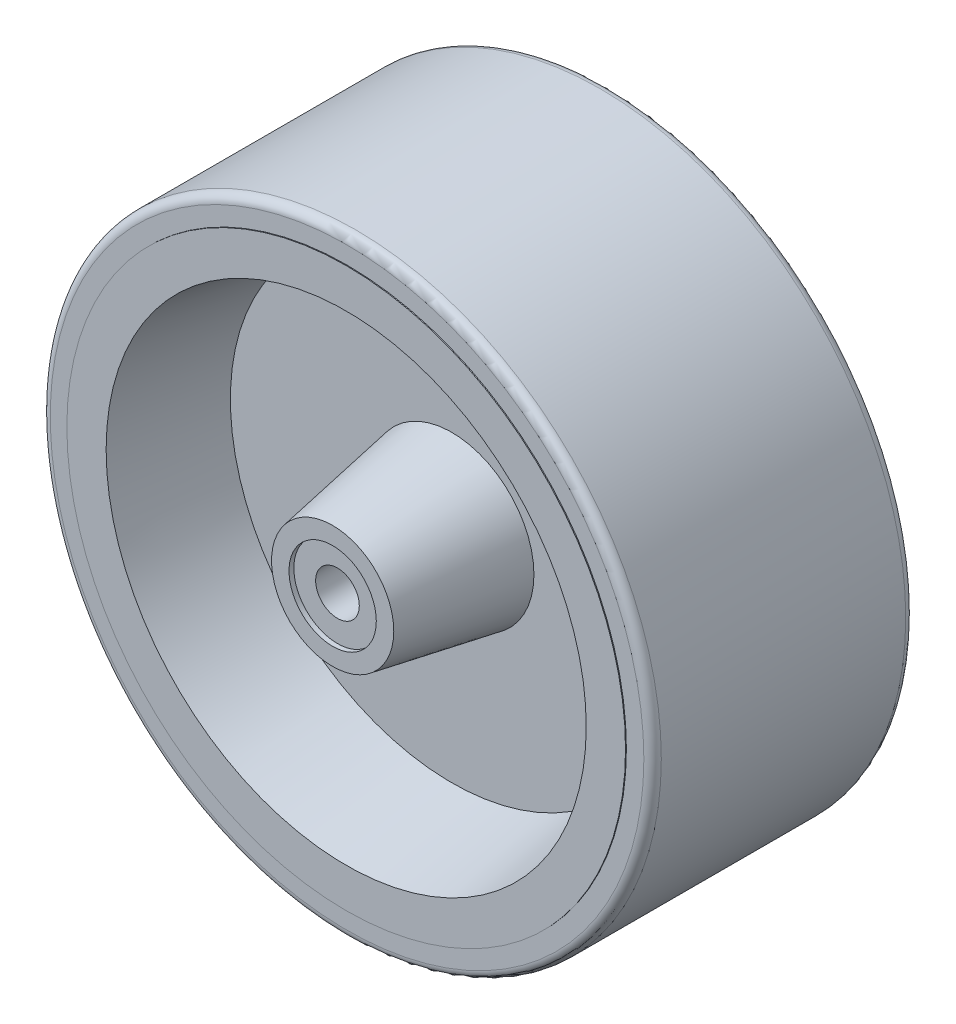
ISO-10303-21;
HEADER;
FILE_DESCRIPTION(('STEP AP214'),'2;1');
FILE_NAME('part.step','',(''),(''),'','','');
FILE_SCHEMA(('AUTOMOTIVE_DESIGN { 1 0 10303 214 1 1 1 1 }'));
ENDSEC;
DATA;
#1=APPLICATION_CONTEXT('core data for automotive mechanical design processes');
#2=APPLICATION_PROTOCOL_DEFINITION('international standard','automotive_design',2000,#1);
#3=PRODUCT_CONTEXT('',#1,'mechanical');
#4=PRODUCT('Part','Part','',(#3));
#5=PRODUCT_RELATED_PRODUCT_CATEGORY('part','',(#4));
#6=PRODUCT_DEFINITION_FORMATION('','',#4);
#7=PRODUCT_DEFINITION_CONTEXT('part definition',#1,'design');
#8=PRODUCT_DEFINITION('design','',#6,#7);
#9=PRODUCT_DEFINITION_SHAPE('','',#8);
#10=(LENGTH_UNIT() NAMED_UNIT(*) SI_UNIT(.MILLI.,.METRE.));
#11=(NAMED_UNIT(*) PLANE_ANGLE_UNIT() SI_UNIT($,.RADIAN.));
#12=(NAMED_UNIT(*) SI_UNIT($,.STERADIAN.) SOLID_ANGLE_UNIT());
#13=UNCERTAINTY_MEASURE_WITH_UNIT(LENGTH_MEASURE(1.E-05),#10,'distance_accuracy_value','');
#14=(GEOMETRIC_REPRESENTATION_CONTEXT(3) GLOBAL_UNCERTAINTY_ASSIGNED_CONTEXT((#13)) GLOBAL_UNIT_ASSIGNED_CONTEXT((#10,
#11,#12)) REPRESENTATION_CONTEXT('',''));
#15=CARTESIAN_POINT('',(0.,0.,0.));
#16=DIRECTION('',(0.,0.,1.));
#17=DIRECTION('',(1.,0.,0.));
#18=AXIS2_PLACEMENT_3D('',#15,#16,#17);
#19=CARTESIAN_POINT('',(0.,0.,-40.894));
#20=DIRECTION('',(0.,0.,1.));
#21=DIRECTION('',(1.,0.,0.));
#22=AXIS2_PLACEMENT_3D('',#19,#20,#21);
#23=PLANE('',#22);
#24=CARTESIAN_POINT('',(0.,0.,-40.894));
#25=DIRECTION('',(0.,0.,1.));
#26=DIRECTION('',(1.,0.,0.));
#27=AXIS2_PLACEMENT_3D('',#24,#25,#26);
#28=CIRCLE('',#27,6.35);
#29=CARTESIAN_POINT('',(6.35,0.,-40.894));
#30=VERTEX_POINT('',#29);
#31=EDGE_CURVE('E49',#30,#30,#28,.T.);
#32=ORIENTED_EDGE('',*,*,#31,.T.);
#33=EDGE_LOOP('',(#32));
#34=FACE_BOUND('',#33,.T.);
#35=CARTESIAN_POINT('',(0.,0.,-40.894));
#36=DIRECTION('',(0.,0.,1.));
#37=DIRECTION('',(1.,0.,0.));
#38=AXIS2_PLACEMENT_3D('',#35,#36,#37);
#39=CIRCLE('',#38,12.7);
#40=CARTESIAN_POINT('',(12.7,0.,-40.894));
#41=VERTEX_POINT('',#40);
#42=EDGE_CURVE('E105',#41,#41,#39,.T.);
#43=ORIENTED_EDGE('',*,*,#42,.F.);
#44=EDGE_LOOP('',(#43));
#45=FACE_BOUND('',#44,.T.);
#46=ADVANCED_FACE('F46',(#34,#45),#23,.F.);
#47=CARTESIAN_POINT('',(0.,0.,40.894));
#48=DIRECTION('',(0.,0.,-1.));
#49=DIRECTION('',(-1.,0.,0.));
#50=AXIS2_PLACEMENT_3D('',#47,#48,#49);
#51=PLANE('',#50);
#52=CARTESIAN_POINT('',(0.,0.,40.894));
#53=DIRECTION('',(0.,0.,1.));
#54=DIRECTION('',(1.,0.,0.));
#55=AXIS2_PLACEMENT_3D('',#52,#53,#54);
#56=CIRCLE('',#55,6.35);
#57=CARTESIAN_POINT('',(6.35,0.,40.894));
#58=VERTEX_POINT('',#57);
#59=EDGE_CURVE('E109',#58,#58,#56,.T.);
#60=ORIENTED_EDGE('',*,*,#59,.F.);
#61=EDGE_LOOP('',(#60));
#62=FACE_BOUND('',#61,.T.);
#63=CARTESIAN_POINT('',(0.,0.,40.894));
#64=DIRECTION('',(0.,0.,1.));
#65=DIRECTION('',(1.,0.,0.));
#66=AXIS2_PLACEMENT_3D('',#63,#64,#65);
#67=CIRCLE('',#66,12.7);
#68=CARTESIAN_POINT('',(12.7,0.,40.894));
#69=VERTEX_POINT('',#68);
#70=EDGE_CURVE('E11',#69,#69,#67,.T.);
#71=ORIENTED_EDGE('',*,*,#70,.T.);
#72=EDGE_LOOP('',(#71));
#73=FACE_BOUND('',#72,.T.);
#74=ADVANCED_FACE('F131',(#62,#73),#51,.F.);
#75=CARTESIAN_POINT('',(0.,0.,0.));
#76=DIRECTION('',(0.,0.,1.));
#77=DIRECTION('',(1.,0.,0.));
#78=AXIS2_PLACEMENT_3D('',#75,#76,#77);
#79=CYLINDRICAL_SURFACE('',#78,12.7);
#80=ORIENTED_EDGE('',*,*,#70,.F.);
#81=EDGE_LOOP('',(#80));
#82=FACE_BOUND('',#81,.T.);
#83=CARTESIAN_POINT('',(0.,0.,42.291));
#84=DIRECTION('',(0.,0.,1.));
#85=DIRECTION('',(1.,0.,0.));
#86=AXIS2_PLACEMENT_3D('',#83,#84,#85);
#87=CIRCLE('',#86,12.7);
#88=CARTESIAN_POINT('',(12.7,0.,42.291));
#89=VERTEX_POINT('',#88);
#90=EDGE_CURVE('E54',#89,#89,#87,.T.);
#91=ORIENTED_EDGE('',*,*,#90,.T.);
#92=EDGE_LOOP('',(#91));
#93=FACE_BOUND('',#92,.T.);
#94=ADVANCED_FACE('F135',(#82,#93),#79,.F.);
#95=CARTESIAN_POINT('',(-12.7,0.,42.291));
#96=DIRECTION('',(0.,0.,-1.));
#97=DIRECTION('',(-1.,0.,0.));
#98=AXIS2_PLACEMENT_3D('',#95,#96,#97);
#99=PLANE('',#98);
#100=ORIENTED_EDGE('',*,*,#90,.F.);
#101=EDGE_LOOP('',(#100));
#102=FACE_BOUND('',#101,.T.);
#103=CARTESIAN_POINT('',(0.,0.,42.291));
#104=DIRECTION('',(0.,0.,1.));
#105=DIRECTION('',(1.,0.,0.));
#106=AXIS2_PLACEMENT_3D('',#103,#104,#105);
#107=CIRCLE('',#106,17.78);
#108=CARTESIAN_POINT('',(17.78,0.,42.291));
#109=VERTEX_POINT('',#108);
#110=EDGE_CURVE('E59',#109,#109,#107,.T.);
#111=ORIENTED_EDGE('',*,*,#110,.T.);
#112=EDGE_LOOP('',(#111));
#113=FACE_BOUND('',#112,.T.);
#114=ADVANCED_FACE('F140',(#102,#113),#99,.F.);
#115=CARTESIAN_POINT('',(0.,0.,7.62));
#116=DIRECTION('',(0.,0.,-1.));
#117=DIRECTION('',(-1.,0.,0.));
#118=AXIS2_PLACEMENT_3D('',#115,#116,#117);
#119=CONICAL_SURFACE('',#118,23.8934327481431,0.17453292519943);
#120=ORIENTED_EDGE('',*,*,#110,.F.);
#121=EDGE_LOOP('',(#120));
#122=FACE_BOUND('',#121,.T.);
#123=CARTESIAN_POINT('',(0.,0.,7.62));
#124=DIRECTION('',(0.,0.,1.));
#125=DIRECTION('',(1.,0.,0.));
#126=AXIS2_PLACEMENT_3D('',#123,#124,#125);
#127=CIRCLE('',#126,23.8934327481431);
#128=CARTESIAN_POINT('',(23.8934327481431,0.,7.62));
#129=VERTEX_POINT('',#128);
#130=EDGE_CURVE('E65',#129,#129,#127,.T.);
#131=ORIENTED_EDGE('',*,*,#130,.T.);
#132=EDGE_LOOP('',(#131));
#133=FACE_BOUND('',#132,.T.);
#134=ADVANCED_FACE('F146',(#122,#133),#119,.T.);
#135=CARTESIAN_POINT('',(-23.8934327481431,0.,7.62));
#136=DIRECTION('',(0.,0.,-1.));
#137=DIRECTION('',(-1.,0.,0.));
#138=AXIS2_PLACEMENT_3D('',#135,#136,#137);
#139=PLANE('',#138);
#140=ORIENTED_EDGE('',*,*,#130,.F.);
#141=EDGE_LOOP('',(#140));
#142=FACE_BOUND('',#141,.T.);
#143=CARTESIAN_POINT('',(0.,0.,7.62000000000001));
#144=DIRECTION('',(0.,0.,1.));
#145=DIRECTION('',(1.,0.,0.));
#146=AXIS2_PLACEMENT_3D('',#143,#144,#145);
#147=CIRCLE('',#146,64.4307665749062);
#148=CARTESIAN_POINT('',(64.4307665749062,0.,7.62000000000001));
#149=VERTEX_POINT('',#148);
#150=EDGE_CURVE('E69',#149,#149,#147,.T.);
#151=ORIENTED_EDGE('',*,*,#150,.T.);
#152=EDGE_LOOP('',(#151));
#153=FACE_BOUND('',#152,.T.);
#154=ADVANCED_FACE('F150',(#142,#153),#139,.F.);
#155=CARTESIAN_POINT('',(0.,0.,38.354));
#156=DIRECTION('',(0.,0.,1.));
#157=DIRECTION('',(1.,0.,0.));
#158=AXIS2_PLACEMENT_3D('',#155,#156,#157);
#159=CONICAL_SURFACE('',#158,69.85,0.174532925199429);
#160=ORIENTED_EDGE('',*,*,#150,.F.);
#161=EDGE_LOOP('',(#160));
#162=FACE_BOUND('',#161,.T.);
#163=CARTESIAN_POINT('',(0.,0.,38.354));
#164=DIRECTION('',(0.,0.,1.));
#165=DIRECTION('',(1.,0.,0.));
#166=AXIS2_PLACEMENT_3D('',#163,#164,#165);
#167=CIRCLE('',#166,69.85);
#168=CARTESIAN_POINT('',(69.85,0.,38.354));
#169=VERTEX_POINT('',#168);
#170=EDGE_CURVE('E73',#169,#169,#167,.T.);
#171=ORIENTED_EDGE('',*,*,#170,.T.);
#172=EDGE_LOOP('',(#171));
#173=FACE_BOUND('',#172,.T.);
#174=ADVANCED_FACE('F154',(#162,#173),#159,.F.);
#175=CARTESIAN_POINT('',(-69.85,0.,38.354));
#176=DIRECTION('',(0.,0.,-1.));
#177=DIRECTION('',(-1.,0.,0.));
#178=AXIS2_PLACEMENT_3D('',#175,#176,#177);
#179=PLANE('',#178);
#180=ORIENTED_EDGE('',*,*,#170,.F.);
#181=EDGE_LOOP('',(#180));
#182=FACE_BOUND('',#181,.T.);
#183=CARTESIAN_POINT('',(0.,0.,38.354));
#184=DIRECTION('',(0.,0.,1.));
#185=DIRECTION('',(1.,0.,0.));
#186=AXIS2_PLACEMENT_3D('',#183,#184,#185);
#187=CIRCLE('',#186,81.28);
#188=CARTESIAN_POINT('',(81.28,0.,38.354));
#189=VERTEX_POINT('',#188);
#190=EDGE_CURVE('E77',#189,#189,#187,.T.);
#191=ORIENTED_EDGE('',*,*,#190,.T.);
#192=EDGE_LOOP('',(#191));
#193=FACE_BOUND('',#192,.T.);
#194=ADVANCED_FACE('F158',(#182,#193),#179,.F.);
#195=CARTESIAN_POINT('',(0.,0.,0.));
#196=DIRECTION('',(0.,0.,1.));
#197=DIRECTION('',(1.,0.,0.));
#198=AXIS2_PLACEMENT_3D('',#195,#196,#197);
#199=CYLINDRICAL_SURFACE('',#198,81.28);
#200=ORIENTED_EDGE('',*,*,#190,.F.);
#201=EDGE_LOOP('',(#200));
#202=FACE_BOUND('',#201,.T.);
#203=CARTESIAN_POINT('',(0.,0.,-38.354));
#204=DIRECTION('',(0.,0.,1.));
#205=DIRECTION('',(1.,0.,0.));
#206=AXIS2_PLACEMENT_3D('',#203,#204,#205);
#207=CIRCLE('',#206,81.28);
#208=CARTESIAN_POINT('',(81.28,0.,-38.354));
#209=VERTEX_POINT('',#208);
#210=EDGE_CURVE('E81',#209,#209,#207,.T.);
#211=ORIENTED_EDGE('',*,*,#210,.T.);
#212=EDGE_LOOP('',(#211));
#213=FACE_BOUND('',#212,.T.);
#214=ADVANCED_FACE('F162',(#202,#213),#199,.T.);
#215=CARTESIAN_POINT('',(-69.85,0.,-38.354));
#216=DIRECTION('',(0.,0.,1.));
#217=DIRECTION('',(1.,0.,0.));
#218=AXIS2_PLACEMENT_3D('',#215,#216,#217);
#219=PLANE('',#218);
#220=ORIENTED_EDGE('',*,*,#210,.F.);
#221=EDGE_LOOP('',(#220));
#222=FACE_BOUND('',#221,.T.);
#223=CARTESIAN_POINT('',(0.,0.,-38.354));
#224=DIRECTION('',(0.,0.,1.));
#225=DIRECTION('',(1.,0.,0.));
#226=AXIS2_PLACEMENT_3D('',#223,#224,#225);
#227=CIRCLE('',#226,69.85);
#228=CARTESIAN_POINT('',(69.85,0.,-38.354));
#229=VERTEX_POINT('',#228);
#230=EDGE_CURVE('E85',#229,#229,#227,.T.);
#231=ORIENTED_EDGE('',*,*,#230,.T.);
#232=EDGE_LOOP('',(#231));
#233=FACE_BOUND('',#232,.T.);
#234=ADVANCED_FACE('F166',(#222,#233),#219,.F.);
#235=CARTESIAN_POINT('',(0.,0.,-7.62000000000001));
#236=DIRECTION('',(0.,0.,-1.));
#237=DIRECTION('',(-1.,0.,0.));
#238=AXIS2_PLACEMENT_3D('',#235,#236,#237);
#239=CONICAL_SURFACE('',#238,64.4307665749062,0.174532925199429);
#240=ORIENTED_EDGE('',*,*,#230,.F.);
#241=EDGE_LOOP('',(#240));
#242=FACE_BOUND('',#241,.T.);
#243=CARTESIAN_POINT('',(0.,0.,-7.62000000000001));
#244=DIRECTION('',(0.,0.,1.));
#245=DIRECTION('',(1.,0.,0.));
#246=AXIS2_PLACEMENT_3D('',#243,#244,#245);
#247=CIRCLE('',#246,64.4307665749062);
#248=CARTESIAN_POINT('',(64.4307665749062,0.,-7.62000000000001));
#249=VERTEX_POINT('',#248);
#250=EDGE_CURVE('E89',#249,#249,#247,.T.);
#251=ORIENTED_EDGE('',*,*,#250,.T.);
#252=EDGE_LOOP('',(#251));
#253=FACE_BOUND('',#252,.T.);
#254=ADVANCED_FACE('F170',(#242,#253),#239,.F.);
#255=CARTESIAN_POINT('',(-23.8934327481431,0.,-7.62));
#256=DIRECTION('',(0.,0.,1.));
#257=DIRECTION('',(1.,0.,0.));
#258=AXIS2_PLACEMENT_3D('',#255,#256,#257);
#259=PLANE('',#258);
#260=ORIENTED_EDGE('',*,*,#250,.F.);
#261=EDGE_LOOP('',(#260));
#262=FACE_BOUND('',#261,.T.);
#263=CARTESIAN_POINT('',(0.,0.,-7.62));
#264=DIRECTION('',(0.,0.,1.));
#265=DIRECTION('',(1.,0.,0.));
#266=AXIS2_PLACEMENT_3D('',#263,#264,#265);
#267=CIRCLE('',#266,23.8934327481431);
#268=CARTESIAN_POINT('',(23.8934327481431,0.,-7.62));
#269=VERTEX_POINT('',#268);
#270=EDGE_CURVE('E93',#269,#269,#267,.T.);
#271=ORIENTED_EDGE('',*,*,#270,.T.);
#272=EDGE_LOOP('',(#271));
#273=FACE_BOUND('',#272,.T.);
#274=ADVANCED_FACE('F174',(#262,#273),#259,.F.);
#275=CARTESIAN_POINT('',(0.,0.,-42.291));
#276=DIRECTION('',(0.,0.,1.));
#277=DIRECTION('',(1.,0.,0.));
#278=AXIS2_PLACEMENT_3D('',#275,#276,#277);
#279=CONICAL_SURFACE('',#278,17.78,0.17453292519943);
#280=ORIENTED_EDGE('',*,*,#270,.F.);
#281=EDGE_LOOP('',(#280));
#282=FACE_BOUND('',#281,.T.);
#283=CARTESIAN_POINT('',(0.,0.,-42.291));
#284=DIRECTION('',(0.,0.,1.));
#285=DIRECTION('',(1.,0.,0.));
#286=AXIS2_PLACEMENT_3D('',#283,#284,#285);
#287=CIRCLE('',#286,17.78);
#288=CARTESIAN_POINT('',(17.78,0.,-42.291));
#289=VERTEX_POINT('',#288);
#290=EDGE_CURVE('E97',#289,#289,#287,.T.);
#291=ORIENTED_EDGE('',*,*,#290,.T.);
#292=EDGE_LOOP('',(#291));
#293=FACE_BOUND('',#292,.T.);
#294=ADVANCED_FACE('F178',(#282,#293),#279,.T.);
#295=CARTESIAN_POINT('',(-12.7,0.,-42.291));
#296=DIRECTION('',(0.,0.,1.));
#297=DIRECTION('',(1.,0.,0.));
#298=AXIS2_PLACEMENT_3D('',#295,#296,#297);
#299=PLANE('',#298);
#300=ORIENTED_EDGE('',*,*,#290,.F.);
#301=EDGE_LOOP('',(#300));
#302=FACE_BOUND('',#301,.T.);
#303=CARTESIAN_POINT('',(0.,0.,-42.291));
#304=DIRECTION('',(0.,0.,1.));
#305=DIRECTION('',(1.,0.,0.));
#306=AXIS2_PLACEMENT_3D('',#303,#304,#305);
#307=CIRCLE('',#306,12.7);
#308=CARTESIAN_POINT('',(12.7,0.,-42.291));
#309=VERTEX_POINT('',#308);
#310=EDGE_CURVE('E101',#309,#309,#307,.T.);
#311=ORIENTED_EDGE('',*,*,#310,.T.);
#312=EDGE_LOOP('',(#311));
#313=FACE_BOUND('',#312,.T.);
#314=ADVANCED_FACE('F127',(#302,#313),#299,.F.);
#315=CARTESIAN_POINT('',(0.,0.,0.));
#316=DIRECTION('',(0.,0.,1.));
#317=DIRECTION('',(1.,0.,0.));
#318=AXIS2_PLACEMENT_3D('',#315,#316,#317);
#319=CYLINDRICAL_SURFACE('',#318,12.7);
#320=ORIENTED_EDGE('',*,*,#310,.F.);
#321=EDGE_LOOP('',(#320));
#322=FACE_BOUND('',#321,.T.);
#323=ORIENTED_EDGE('',*,*,#42,.T.);
#324=EDGE_LOOP('',(#323));
#325=FACE_BOUND('',#324,.T.);
#326=ADVANCED_FACE('F122',(#322,#325),#319,.F.);
#327=CARTESIAN_POINT('',(0.,0.,-42.291));
#328=DIRECTION('',(0.,0.,1.));
#329=DIRECTION('',(1.,0.,0.));
#330=AXIS2_PLACEMENT_3D('',#327,#328,#329);
#331=CYLINDRICAL_SURFACE('',#330,6.35);
#332=ORIENTED_EDGE('',*,*,#59,.T.);
#333=EDGE_LOOP('',(#332));
#334=FACE_BOUND('',#333,.T.);
#335=ORIENTED_EDGE('',*,*,#31,.F.);
#336=EDGE_LOOP('',(#335));
#337=FACE_BOUND('',#336,.T.);
#338=ADVANCED_FACE('F120',(#334,#337),#331,.F.);
#339=CLOSED_SHELL('',(#46,#74,#94,#114,#134,#154,#174,#194,#214,#234,#254,#274,#294,#314,#326,#338));
#340=MANIFOLD_SOLID_BREP('B2',#339);
#341=CARTESIAN_POINT('',(0.,0.,38.1));
#342=DIRECTION('',(0.,0.,1.));
#343=DIRECTION('',(1.,0.,0.));
#344=AXIS2_PLACEMENT_3D('',#341,#342,#343);
#345=PLANE('',#344);
#346=CARTESIAN_POINT('',(0.,0.,38.1));
#347=DIRECTION('',(0.,0.,1.));
#348=DIRECTION('',(1.,0.,0.));
#349=AXIS2_PLACEMENT_3D('',#346,#347,#348);
#350=CIRCLE('',#349,86.36);
#351=CARTESIAN_POINT('',(86.36,0.,38.1));
#352=VERTEX_POINT('',#351);
#353=EDGE_CURVE('E45',#352,#352,#350,.T.);
#354=ORIENTED_EDGE('',*,*,#353,.T.);
#355=EDGE_LOOP('',(#354));
#356=FACE_BOUND('',#355,.T.);
#357=CARTESIAN_POINT('',(0.,0.,38.1));
#358=DIRECTION('',(0.,0.,1.));
#359=DIRECTION('',(1.,0.,0.));
#360=AXIS2_PLACEMENT_3D('',#357,#358,#359);
#361=CIRCLE('',#360,78.74);
#362=CARTESIAN_POINT('',(-78.74,0.,38.1));
#363=VERTEX_POINT('',#362);
#364=EDGE_CURVE('E323',#363,#363,#361,.T.);
#365=ORIENTED_EDGE('',*,*,#364,.F.);
#366=EDGE_LOOP('',(#365));
#367=FACE_BOUND('',#366,.T.);
#368=ADVANCED_FACE('F303',(#356,#367),#345,.T.);
#369=CARTESIAN_POINT('',(0.,0.,-38.1));
#370=DIRECTION('',(0.,0.,1.));
#371=DIRECTION('',(1.,0.,0.));
#372=AXIS2_PLACEMENT_3D('',#369,#370,#371);
#373=PLANE('',#372);
#374=CARTESIAN_POINT('',(0.,0.,-38.1));
#375=DIRECTION('',(0.,0.,1.));
#376=DIRECTION('',(1.,0.,0.));
#377=AXIS2_PLACEMENT_3D('',#374,#375,#376);
#378=CIRCLE('',#377,86.36);
#379=CARTESIAN_POINT('',(86.36,0.,-38.1));
#380=VERTEX_POINT('',#379);
#381=EDGE_CURVE('E310',#380,#380,#378,.F.);
#382=ORIENTED_EDGE('',*,*,#381,.T.);
#383=EDGE_LOOP('',(#382));
#384=FACE_BOUND('',#383,.T.);
#385=CARTESIAN_POINT('',(0.,0.,-38.1));
#386=DIRECTION('',(0.,0.,1.));
#387=DIRECTION('',(1.,0.,0.));
#388=AXIS2_PLACEMENT_3D('',#385,#386,#387);
#389=CIRCLE('',#388,78.74);
#390=CARTESIAN_POINT('',(-78.74,0.,-38.1));
#391=VERTEX_POINT('',#390);
#392=EDGE_CURVE('E324',#391,#391,#389,.T.);
#393=ORIENTED_EDGE('',*,*,#392,.T.);
#394=EDGE_LOOP('',(#393));
#395=FACE_BOUND('',#394,.T.);
#396=ADVANCED_FACE('F334',(#384,#395),#373,.F.);
#397=CARTESIAN_POINT('',(0.,0.,38.1));
#398=DIRECTION('',(0.,0.,-1.));
#399=DIRECTION('',(-1.,0.,0.));
#400=AXIS2_PLACEMENT_3D('',#397,#398,#399);
#401=CYLINDRICAL_SURFACE('',#400,88.9);
#402=CARTESIAN_POINT('',(0.,0.,-35.56));
#403=DIRECTION('',(0.,0.,1.));
#404=DIRECTION('',(1.,0.,0.));
#405=AXIS2_PLACEMENT_3D('',#402,#403,#404);
#406=CIRCLE('',#405,88.9);
#407=CARTESIAN_POINT('',(-88.9,0.,-35.56));
#408=VERTEX_POINT('',#407);
#409=EDGE_CURVE('E314',#408,#408,#406,.T.);
#410=CARTESIAN_POINT('',(0.,0.,35.56));
#411=DIRECTION('',(0.,0.,1.));
#412=DIRECTION('',(1.,0.,0.));
#413=AXIS2_PLACEMENT_3D('',#410,#411,#412);
#414=CIRCLE('',#413,88.9);
#415=CARTESIAN_POINT('',(-88.9,0.,35.56));
#416=VERTEX_POINT('',#415);
#417=EDGE_CURVE('E318',#416,#416,#414,.F.);
#418=CARTESIAN_POINT('',(-88.9,0.,-35.56));
#419=CARTESIAN_POINT('',(-88.9,0.,-34.8191666666667));
#420=CARTESIAN_POINT('',(-88.9,0.,-34.0783333333333));
#421=CARTESIAN_POINT('',(-88.9,0.,-32.5966666666667));
#422=CARTESIAN_POINT('',(-88.9,0.,-31.8558333333333));
#423=CARTESIAN_POINT('',(-88.9,0.,-30.3741666666667));
#424=CARTESIAN_POINT('',(-88.9,0.,-29.6333333333333));
#425=CARTESIAN_POINT('',(-88.9,0.,-28.1516666666667));
#426=CARTESIAN_POINT('',(-88.9,0.,-27.4108333333333));
#427=CARTESIAN_POINT('',(-88.9,0.,-25.9291666666667));
#428=CARTESIAN_POINT('',(-88.9,0.,-25.1883333333333));
#429=CARTESIAN_POINT('',(-88.9,0.,-23.7066666666667));
#430=CARTESIAN_POINT('',(-88.9,0.,-22.9658333333334));
#431=CARTESIAN_POINT('',(-88.9,0.,-21.4841666666667));
#432=CARTESIAN_POINT('',(-88.9,0.,-20.7433333333333));
#433=CARTESIAN_POINT('',(-88.9,0.,-19.2616666666667));
#434=CARTESIAN_POINT('',(-88.9,0.,-18.5208333333333));
#435=CARTESIAN_POINT('',(-88.9,0.,-17.0391666666667));
#436=CARTESIAN_POINT('',(-88.9,0.,-16.2983333333333));
#437=CARTESIAN_POINT('',(-88.9,0.,-14.8166666666667));
#438=CARTESIAN_POINT('',(-88.9,0.,-14.0758333333333));
#439=CARTESIAN_POINT('',(-88.9,0.,-12.5941666666667));
#440=CARTESIAN_POINT('',(-88.9,0.,-11.8533333333333));
#441=CARTESIAN_POINT('',(-88.9,0.,-10.3716666666667));
#442=CARTESIAN_POINT('',(-88.9,0.,-9.63083333333334));
#443=CARTESIAN_POINT('',(-88.9,0.,-8.14916666666667));
#444=CARTESIAN_POINT('',(-88.9,0.,-7.40833333333334));
#445=CARTESIAN_POINT('',(-88.9,0.,-5.92666666666667));
#446=CARTESIAN_POINT('',(-88.9,0.,-5.18583333333334));
#447=CARTESIAN_POINT('',(-88.9,0.,-3.70416666666667));
#448=CARTESIAN_POINT('',(-88.9,0.,-2.96333333333334));
#449=CARTESIAN_POINT('',(-88.9,0.,-1.48166666666667));
#450=CARTESIAN_POINT('',(-88.9,0.,-0.740833333333341));
#451=CARTESIAN_POINT('',(-88.9,0.,0.740833333333327));
#452=CARTESIAN_POINT('',(-88.9,0.,1.48166666666666));
#453=CARTESIAN_POINT('',(-88.9,0.,2.96333333333333));
#454=CARTESIAN_POINT('',(-88.9,0.,3.70416666666666));
#455=CARTESIAN_POINT('',(-88.9,0.,5.18583333333333));
#456=CARTESIAN_POINT('',(-88.9,0.,5.92666666666666));
#457=CARTESIAN_POINT('',(-88.9,0.,7.40833333333333));
#458=CARTESIAN_POINT('',(-88.9,0.,8.14916666666666));
#459=CARTESIAN_POINT('',(-88.9,0.,9.63083333333333));
#460=CARTESIAN_POINT('',(-88.9,0.,10.3716666666667));
#461=CARTESIAN_POINT('',(-88.9,0.,11.8533333333333));
#462=CARTESIAN_POINT('',(-88.9,0.,12.5941666666667));
#463=CARTESIAN_POINT('',(-88.9,0.,14.0758333333333));
#464=CARTESIAN_POINT('',(-88.9,0.,14.8166666666667));
#465=CARTESIAN_POINT('',(-88.9,0.,16.2983333333333));
#466=CARTESIAN_POINT('',(-88.9,0.,17.0391666666667));
#467=CARTESIAN_POINT('',(-88.9,0.,18.5208333333333));
#468=CARTESIAN_POINT('',(-88.9,0.,19.2616666666667));
#469=CARTESIAN_POINT('',(-88.9,0.,20.7433333333333));
#470=CARTESIAN_POINT('',(-88.9,0.,21.4841666666667));
#471=CARTESIAN_POINT('',(-88.9,0.,22.9658333333333));
#472=CARTESIAN_POINT('',(-88.9,0.,23.7066666666667));
#473=CARTESIAN_POINT('',(-88.9,0.,25.1883333333333));
#474=CARTESIAN_POINT('',(-88.9,0.,25.9291666666667));
#475=CARTESIAN_POINT('',(-88.9,0.,27.4108333333333));
#476=CARTESIAN_POINT('',(-88.9,0.,28.1516666666667));
#477=CARTESIAN_POINT('',(-88.9,0.,29.6333333333333));
#478=CARTESIAN_POINT('',(-88.9,0.,30.3741666666667));
#479=CARTESIAN_POINT('',(-88.9,0.,31.8558333333333));
#480=CARTESIAN_POINT('',(-88.9,0.,32.5966666666667));
#481=CARTESIAN_POINT('',(-88.9,0.,34.0783333333333));
#482=CARTESIAN_POINT('',(-88.9,0.,34.8191666666667));
#483=CARTESIAN_POINT('',(-88.9,0.,35.56));
#484=B_SPLINE_CURVE_WITH_KNOTS('',3,(#418,#419,#420,#421,#422,#423,#424,#425,#426,#427,#428,
#429,#430,#431,#432,#433,#434,#435,#436,#437,#438,#439,#440,#441,#442,#443,#444,#445,#446,#447,
#448,#449,#450,#451,#452,#453,#454,#455,#456,#457,#458,#459,#460,#461,#462,#463,#464,#465,#466,
#467,#468,#469,#470,#471,#472,#473,#474,#475,#476,#477,#478,#479,#480,#481,#482,#483),
.UNSPECIFIED.,.F.,.F.,(4,2,2,2,2,2,2,2,2,2,2,2,2,2,2,2,2,2,2,2,2,2,2,2,2,2,2,2,2,2,2,2,4),(0.,
2.2225,4.445,6.66750000000001,8.89000000000001,11.1125,13.335,15.5575,17.78,20.0025,22.225,
24.4475,26.67,28.8925,31.115,33.3375,35.56,37.7825,40.005,42.2275,44.45,46.6725,48.895,51.1175,
53.34,55.5625,57.785,60.0075,62.23,64.4525,66.675,68.8975,71.12),.UNSPECIFIED.);
#485=EDGE_CURVE('BSEAM339',#408,#416,#484,.T.);
#486=ORIENTED_EDGE('',*,*,#409,.T.);
#487=ORIENTED_EDGE('',*,*,#417,.T.);
#488=ORIENTED_EDGE('',*,*,#485,.T.);
#489=ORIENTED_EDGE('',*,*,#485,.F.);
#490=EDGE_LOOP('',(#486,#488,#487,#489));
#491=FACE_BOUND('',#490,.T.);
#492=ADVANCED_FACE('F339',(#491),#401,.T.);
#493=CARTESIAN_POINT('',(0.,0.,38.1));
#494=DIRECTION('',(0.,0.,-1.));
#495=DIRECTION('',(-1.,0.,0.));
#496=AXIS2_PLACEMENT_3D('',#493,#494,#495);
#497=CYLINDRICAL_SURFACE('',#496,78.74);
#498=CARTESIAN_POINT('',(-78.74,0.,38.1));
#499=CARTESIAN_POINT('',(-78.74,0.,37.30625));
#500=CARTESIAN_POINT('',(-78.74,0.,36.5125));
#501=CARTESIAN_POINT('',(-78.74,0.,34.925));
#502=CARTESIAN_POINT('',(-78.74,0.,34.13125));
#503=CARTESIAN_POINT('',(-78.74,0.,32.54375));
#504=CARTESIAN_POINT('',(-78.74,0.,31.75));
#505=CARTESIAN_POINT('',(-78.74,0.,30.1625));
#506=CARTESIAN_POINT('',(-78.74,0.,29.36875));
#507=CARTESIAN_POINT('',(-78.74,0.,27.78125));
#508=CARTESIAN_POINT('',(-78.74,0.,26.9875));
#509=CARTESIAN_POINT('',(-78.74,0.,25.4));
#510=CARTESIAN_POINT('',(-78.74,0.,24.60625));
#511=CARTESIAN_POINT('',(-78.74,0.,23.01875));
#512=CARTESIAN_POINT('',(-78.74,0.,22.225));
#513=CARTESIAN_POINT('',(-78.74,0.,20.6375));
#514=CARTESIAN_POINT('',(-78.74,0.,19.84375));
#515=CARTESIAN_POINT('',(-78.74,0.,18.25625));
#516=CARTESIAN_POINT('',(-78.74,0.,17.4625));
#517=CARTESIAN_POINT('',(-78.74,0.,15.875));
#518=CARTESIAN_POINT('',(-78.74,0.,15.08125));
#519=CARTESIAN_POINT('',(-78.74,0.,13.49375));
#520=CARTESIAN_POINT('',(-78.74,0.,12.7));
#521=CARTESIAN_POINT('',(-78.74,0.,11.1125));
#522=CARTESIAN_POINT('',(-78.74,0.,10.31875));
#523=CARTESIAN_POINT('',(-78.74,0.,8.73124999999999));
#524=CARTESIAN_POINT('',(-78.74,0.,7.93749999999999));
#525=CARTESIAN_POINT('',(-78.74,0.,6.35));
#526=CARTESIAN_POINT('',(-78.74,0.,5.55625));
#527=CARTESIAN_POINT('',(-78.74,0.,3.96875));
#528=CARTESIAN_POINT('',(-78.74,0.,3.175));
#529=CARTESIAN_POINT('',(-78.74,0.,1.5875));
#530=CARTESIAN_POINT('',(-78.74,0.,0.793750000000001));
#531=CARTESIAN_POINT('',(-78.74,0.,-0.793750000000001));
#532=CARTESIAN_POINT('',(-78.74,0.,-1.5875));
#533=CARTESIAN_POINT('',(-78.74,0.,-3.175));
#534=CARTESIAN_POINT('',(-78.74,0.,-3.96875));
#535=CARTESIAN_POINT('',(-78.74,0.,-5.55625));
#536=CARTESIAN_POINT('',(-78.74,0.,-6.35));
#537=CARTESIAN_POINT('',(-78.74,0.,-7.93750000000001));
#538=CARTESIAN_POINT('',(-78.74,0.,-8.73125));
#539=CARTESIAN_POINT('',(-78.74,0.,-10.31875));
#540=CARTESIAN_POINT('',(-78.74,0.,-11.1125));
#541=CARTESIAN_POINT('',(-78.74,0.,-12.7));
#542=CARTESIAN_POINT('',(-78.74,0.,-13.49375));
#543=CARTESIAN_POINT('',(-78.74,0.,-15.08125));
#544=CARTESIAN_POINT('',(-78.74,0.,-15.875));
#545=CARTESIAN_POINT('',(-78.74,0.,-17.4625));
#546=CARTESIAN_POINT('',(-78.74,0.,-18.25625));
#547=CARTESIAN_POINT('',(-78.74,0.,-19.84375));
#548=CARTESIAN_POINT('',(-78.74,0.,-20.6375));
#549=CARTESIAN_POINT('',(-78.74,0.,-22.225));
#550=CARTESIAN_POINT('',(-78.74,0.,-23.01875));
#551=CARTESIAN_POINT('',(-78.74,0.,-24.60625));
#552=CARTESIAN_POINT('',(-78.74,0.,-25.4));
#553=CARTESIAN_POINT('',(-78.74,0.,-26.9875));
#554=CARTESIAN_POINT('',(-78.74,0.,-27.78125));
#555=CARTESIAN_POINT('',(-78.74,0.,-29.36875));
#556=CARTESIAN_POINT('',(-78.74,0.,-30.1625));
#557=CARTESIAN_POINT('',(-78.74,0.,-31.75));
#558=CARTESIAN_POINT('',(-78.74,0.,-32.54375));
#559=CARTESIAN_POINT('',(-78.74,0.,-34.13125));
#560=CARTESIAN_POINT('',(-78.74,0.,-34.925));
#561=CARTESIAN_POINT('',(-78.74,0.,-36.5125));
#562=CARTESIAN_POINT('',(-78.74,0.,-37.30625));
#563=CARTESIAN_POINT('',(-78.74,0.,-38.1));
#564=B_SPLINE_CURVE_WITH_KNOTS('',3,(#498,#499,#500,#501,#502,#503,#504,#505,#506,#507,#508,
#509,#510,#511,#512,#513,#514,#515,#516,#517,#518,#519,#520,#521,#522,#523,#524,#525,#526,#527,
#528,#529,#530,#531,#532,#533,#534,#535,#536,#537,#538,#539,#540,#541,#542,#543,#544,#545,#546,
#547,#548,#549,#550,#551,#552,#553,#554,#555,#556,#557,#558,#559,#560,#561,#562,#563),
.UNSPECIFIED.,.F.,.F.,(4,2,2,2,2,2,2,2,2,2,2,2,2,2,2,2,2,2,2,2,2,2,2,2,2,2,2,2,2,2,2,2,4),(0.,
2.38125,4.7625,7.14375,9.52500000000001,11.90625,14.2875,16.66875,19.05,21.43125,23.8125,
26.19375,28.575,30.95625,33.3375,35.71875,38.1,40.48125,42.8625,45.24375,47.625,50.00625,
52.3875,54.76875,57.15,59.53125,61.9125,64.29375,66.675,69.05625,71.4375,73.81875,76.2),.UNSPECIFIED.);
#565=EDGE_CURVE('BSEAM330',#363,#391,#564,.T.);
#566=ORIENTED_EDGE('',*,*,#364,.T.);
#567=ORIENTED_EDGE('',*,*,#392,.F.);
#568=ORIENTED_EDGE('',*,*,#565,.T.);
#569=ORIENTED_EDGE('',*,*,#565,.F.);
#570=EDGE_LOOP('',(#566,#568,#567,#569));
#571=FACE_BOUND('',#570,.T.);
#572=ADVANCED_FACE('F330',(#571),#497,.F.);
#573=CARTESIAN_POINT('',(0.,0.,-35.56));
#574=DIRECTION('',(0.,0.,1.));
#575=DIRECTION('',(1.,0.,0.));
#576=AXIS2_PLACEMENT_3D('',#573,#574,#575);
#577=TOROIDAL_SURFACE('',#576,86.36,2.54);
#578=ORIENTED_EDGE('',*,*,#381,.F.);
#579=EDGE_LOOP('',(#578));
#580=FACE_BOUND('',#579,.T.);
#581=ORIENTED_EDGE('',*,*,#409,.F.);
#582=EDGE_LOOP('',(#581));
#583=FACE_BOUND('',#582,.T.);
#584=ADVANCED_FACE('F345',(#580,#583),#577,.T.);
#585=CARTESIAN_POINT('',(0.,0.,35.56));
#586=DIRECTION('',(0.,0.,1.));
#587=DIRECTION('',(1.,0.,0.));
#588=AXIS2_PLACEMENT_3D('',#585,#586,#587);
#589=TOROIDAL_SURFACE('',#588,86.36,2.54);
#590=ORIENTED_EDGE('',*,*,#417,.F.);
#591=EDGE_LOOP('',(#590));
#592=FACE_BOUND('',#591,.T.);
#593=ORIENTED_EDGE('',*,*,#353,.F.);
#594=EDGE_LOOP('',(#593));
#595=FACE_BOUND('',#594,.T.);
#596=ADVANCED_FACE('F305',(#592,#595),#589,.T.);
#597=CLOSED_SHELL('',(#368,#396,#492,#572,#584,#596));
#598=MANIFOLD_SOLID_BREP('B6',#597);
#599=ADVANCED_BREP_SHAPE_REPRESENTATION('',(#18,#340,#598),#14);
#600=SHAPE_DEFINITION_REPRESENTATION(#9,#599);
ENDSEC;
END-ISO-10303-21;
